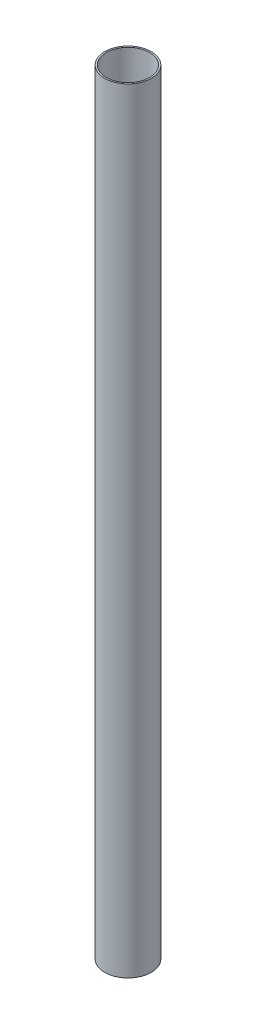
ISO-10303-21;
HEADER;
FILE_DESCRIPTION(('STEP AP214'),'2;1');
FILE_NAME('part.step','',(''),(''),'','','');
FILE_SCHEMA(('AUTOMOTIVE_DESIGN { 1 0 10303 214 1 1 1 1 }'));
ENDSEC;
DATA;
#1=APPLICATION_CONTEXT('core data for automotive mechanical design processes');
#2=APPLICATION_PROTOCOL_DEFINITION('international standard','automotive_design',2000,#1);
#3=PRODUCT_CONTEXT('',#1,'mechanical');
#4=PRODUCT('Part','Part','',(#3));
#5=PRODUCT_RELATED_PRODUCT_CATEGORY('part','',(#4));
#6=PRODUCT_DEFINITION_FORMATION('','',#4);
#7=PRODUCT_DEFINITION_CONTEXT('part definition',#1,'design');
#8=PRODUCT_DEFINITION('design','',#6,#7);
#9=PRODUCT_DEFINITION_SHAPE('','',#8);
#10=(LENGTH_UNIT() NAMED_UNIT(*) SI_UNIT(.MILLI.,.METRE.));
#11=(NAMED_UNIT(*) PLANE_ANGLE_UNIT() SI_UNIT($,.RADIAN.));
#12=(NAMED_UNIT(*) SI_UNIT($,.STERADIAN.) SOLID_ANGLE_UNIT());
#13=UNCERTAINTY_MEASURE_WITH_UNIT(LENGTH_MEASURE(1.E-05),#10,'distance_accuracy_value','');
#14=(GEOMETRIC_REPRESENTATION_CONTEXT(3) GLOBAL_UNCERTAINTY_ASSIGNED_CONTEXT((#13)) GLOBAL_UNIT_ASSIGNED_CONTEXT((#10,
#11,#12)) REPRESENTATION_CONTEXT('',''));
#15=CARTESIAN_POINT('',(0.,0.,0.));
#16=DIRECTION('',(0.,0.,1.));
#17=DIRECTION('',(1.,0.,0.));
#18=AXIS2_PLACEMENT_3D('',#15,#16,#17);
#19=CARTESIAN_POINT('',(0.,100.,0.));
#20=DIRECTION('',(0.,1.,0.));
#21=DIRECTION('',(0.,0.,1.));
#22=AXIS2_PLACEMENT_3D('',#19,#20,#21);
#23=PLANE('',#22);
#24=CARTESIAN_POINT('',(0.,100.,0.));
#25=DIRECTION('',(0.,1.,0.));
#26=DIRECTION('',(0.,0.,1.));
#27=AXIS2_PLACEMENT_3D('',#24,#25,#26);
#28=CIRCLE('',#27,3.);
#29=CARTESIAN_POINT('',(0.,100.,3.));
#30=VERTEX_POINT('',#29);
#31=EDGE_CURVE('E10',#30,#30,#28,.T.);
#32=ORIENTED_EDGE('',*,*,#31,.T.);
#33=EDGE_LOOP('',(#32));
#34=FACE_BOUND('',#33,.T.);
#35=CARTESIAN_POINT('',(0.,100.,0.));
#36=DIRECTION('',(0.,1.,0.));
#37=DIRECTION('',(0.,0.,1.));
#38=AXIS2_PLACEMENT_3D('',#35,#36,#37);
#39=CIRCLE('',#38,2.8);
#40=CARTESIAN_POINT('',(0.,100.,2.8));
#41=VERTEX_POINT('',#40);
#42=EDGE_CURVE('E44',#41,#41,#39,.T.);
#43=ORIENTED_EDGE('',*,*,#42,.F.);
#44=EDGE_LOOP('',(#43));
#45=FACE_BOUND('',#44,.T.);
#46=ADVANCED_FACE('F33',(#34,#45),#23,.T.);
#47=CARTESIAN_POINT('',(0.,0.,0.));
#48=DIRECTION('',(0.,1.,0.));
#49=DIRECTION('',(0.,0.,1.));
#50=AXIS2_PLACEMENT_3D('',#47,#48,#49);
#51=PLANE('',#50);
#52=CARTESIAN_POINT('',(0.,0.,0.));
#53=DIRECTION('',(0.,1.,0.));
#54=DIRECTION('',(0.,0.,1.));
#55=AXIS2_PLACEMENT_3D('',#52,#53,#54);
#56=CIRCLE('',#55,3.);
#57=CARTESIAN_POINT('',(0.,0.,3.));
#58=VERTEX_POINT('',#57);
#59=EDGE_CURVE('E37',#58,#58,#56,.T.);
#60=ORIENTED_EDGE('',*,*,#59,.F.);
#61=EDGE_LOOP('',(#60));
#62=FACE_BOUND('',#61,.T.);
#63=CARTESIAN_POINT('',(0.,0.,0.));
#64=DIRECTION('',(0.,1.,0.));
#65=DIRECTION('',(0.,0.,1.));
#66=AXIS2_PLACEMENT_3D('',#63,#64,#65);
#67=CIRCLE('',#66,2.8);
#68=CARTESIAN_POINT('',(0.,0.,2.8));
#69=VERTEX_POINT('',#68);
#70=EDGE_CURVE('E46',#69,#69,#67,.T.);
#71=ORIENTED_EDGE('',*,*,#70,.T.);
#72=EDGE_LOOP('',(#71));
#73=FACE_BOUND('',#72,.T.);
#74=ADVANCED_FACE('F56',(#62,#73),#51,.F.);
#75=CARTESIAN_POINT('',(0.,100.,0.));
#76=DIRECTION('',(0.,-1.,0.));
#77=DIRECTION('',(0.,0.,-1.));
#78=AXIS2_PLACEMENT_3D('',#75,#76,#77);
#79=CYLINDRICAL_SURFACE('',#78,3.);
#80=ORIENTED_EDGE('',*,*,#31,.F.);
#81=EDGE_LOOP('',(#80));
#82=FACE_BOUND('',#81,.T.);
#83=ORIENTED_EDGE('',*,*,#59,.T.);
#84=EDGE_LOOP('',(#83));
#85=FACE_BOUND('',#84,.T.);
#86=ADVANCED_FACE('F35',(#82,#85),#79,.T.);
#87=CARTESIAN_POINT('',(0.,100.,0.));
#88=DIRECTION('',(0.,-1.,0.));
#89=DIRECTION('',(0.,0.,-1.));
#90=AXIS2_PLACEMENT_3D('',#87,#88,#89);
#91=CYLINDRICAL_SURFACE('',#90,2.8);
#92=ORIENTED_EDGE('',*,*,#42,.T.);
#93=EDGE_LOOP('',(#92));
#94=FACE_BOUND('',#93,.T.);
#95=ORIENTED_EDGE('',*,*,#70,.F.);
#96=EDGE_LOOP('',(#95));
#97=FACE_BOUND('',#96,.T.);
#98=ADVANCED_FACE('F52',(#94,#97),#91,.F.);
#99=CLOSED_SHELL('',(#46,#74,#86,#98));
#100=MANIFOLD_SOLID_BREP('B2',#99);
#101=ADVANCED_BREP_SHAPE_REPRESENTATION('',(#18,#100),#14);
#102=SHAPE_DEFINITION_REPRESENTATION(#9,#101);
ENDSEC;
END-ISO-10303-21;
